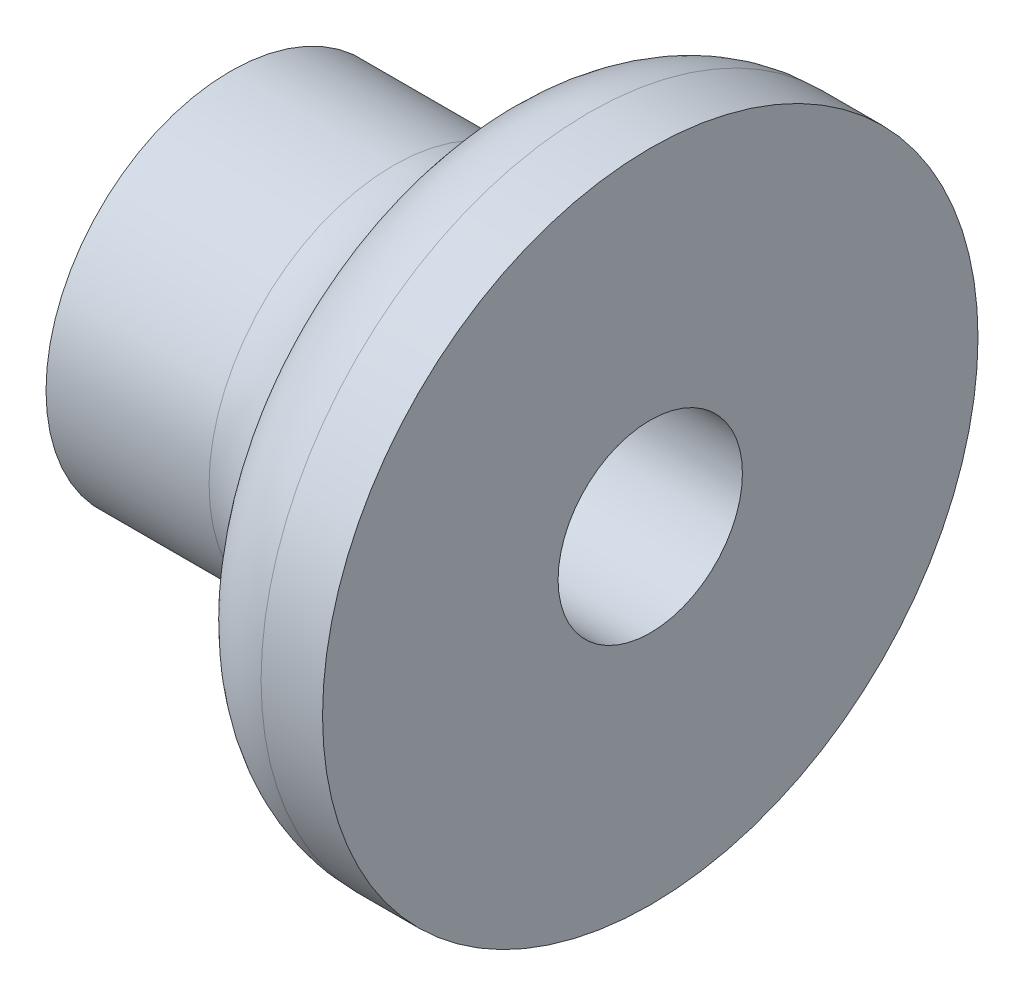
ISO-10303-21;
HEADER;
FILE_DESCRIPTION(('STEP AP214'),'2;1');
FILE_NAME('part.step','',(''),(''),'','','');
FILE_SCHEMA(('AUTOMOTIVE_DESIGN { 1 0 10303 214 1 1 1 1 }'));
ENDSEC;
DATA;
#1=APPLICATION_CONTEXT('core data for automotive mechanical design processes');
#2=APPLICATION_PROTOCOL_DEFINITION('international standard','automotive_design',2000,#1);
#3=PRODUCT_CONTEXT('',#1,'mechanical');
#4=PRODUCT('Part','Part','',(#3));
#5=PRODUCT_RELATED_PRODUCT_CATEGORY('part','',(#4));
#6=PRODUCT_DEFINITION_FORMATION('','',#4);
#7=PRODUCT_DEFINITION_CONTEXT('part definition',#1,'design');
#8=PRODUCT_DEFINITION('design','',#6,#7);
#9=PRODUCT_DEFINITION_SHAPE('','',#8);
#10=(LENGTH_UNIT() NAMED_UNIT(*) SI_UNIT(.MILLI.,.METRE.));
#11=(NAMED_UNIT(*) PLANE_ANGLE_UNIT() SI_UNIT($,.RADIAN.));
#12=(NAMED_UNIT(*) SI_UNIT($,.STERADIAN.) SOLID_ANGLE_UNIT());
#13=UNCERTAINTY_MEASURE_WITH_UNIT(LENGTH_MEASURE(1.E-05),#10,'distance_accuracy_value','');
#14=(GEOMETRIC_REPRESENTATION_CONTEXT(3) GLOBAL_UNCERTAINTY_ASSIGNED_CONTEXT((#13)) GLOBAL_UNIT_ASSIGNED_CONTEXT((#10,
#11,#12)) REPRESENTATION_CONTEXT('',''));
#15=CARTESIAN_POINT('',(0.,0.,0.));
#16=DIRECTION('',(0.,0.,1.));
#17=DIRECTION('',(1.,0.,0.));
#18=AXIS2_PLACEMENT_3D('',#15,#16,#17);
#19=CARTESIAN_POINT('',(10.25,0.,0.));
#20=DIRECTION('',(-1.,0.,0.));
#21=DIRECTION('',(0.,0.,1.));
#22=AXIS2_PLACEMENT_3D('',#19,#20,#21);
#23=CYLINDRICAL_SURFACE('',#22,4.5);
#24=CARTESIAN_POINT('',(3.98030399291527,0.,0.));
#25=DIRECTION('',(1.,0.,0.));
#26=DIRECTION('',(0.,0.,-1.));
#27=AXIS2_PLACEMENT_3D('',#24,#25,#26);
#28=CIRCLE('',#27,4.5);
#29=CARTESIAN_POINT('',(3.98030399291527,0.,-4.5));
#30=VERTEX_POINT('',#29);
#31=EDGE_CURVE('E10',#30,#30,#28,.F.);
#32=ORIENTED_EDGE('',*,*,#31,.T.);
#33=EDGE_LOOP('',(#32));
#34=FACE_BOUND('',#33,.T.);
#35=CARTESIAN_POINT('',(0.,0.,0.));
#36=DIRECTION('',(1.,0.,0.));
#37=DIRECTION('',(0.,0.,-1.));
#38=AXIS2_PLACEMENT_3D('',#35,#36,#37);
#39=CIRCLE('',#38,4.5);
#40=CARTESIAN_POINT('',(0.,0.,-4.5));
#41=VERTEX_POINT('',#40);
#42=EDGE_CURVE('E50',#41,#41,#39,.T.);
#43=ORIENTED_EDGE('',*,*,#42,.T.);
#44=EDGE_LOOP('',(#43));
#45=FACE_BOUND('',#44,.T.);
#46=ADVANCED_FACE('F35',(#34,#45),#23,.T.);
#47=CARTESIAN_POINT('',(10.25,0.,0.));
#48=DIRECTION('',(1.,0.,0.));
#49=DIRECTION('',(0.,0.,-1.));
#50=AXIS2_PLACEMENT_3D('',#47,#48,#49);
#51=PLANE('',#50);
#52=CARTESIAN_POINT('',(10.25,0.,0.));
#53=DIRECTION('',(1.,0.,0.));
#54=DIRECTION('',(0.,0.,-1.));
#55=AXIS2_PLACEMENT_3D('',#52,#53,#54);
#56=CIRCLE('',#55,2.25000000804048);
#57=CARTESIAN_POINT('',(10.25,0.,-2.25000000804048));
#58=VERTEX_POINT('',#57);
#59=EDGE_CURVE('E55',#58,#58,#56,.T.);
#60=ORIENTED_EDGE('',*,*,#59,.F.);
#61=EDGE_LOOP('',(#60));
#62=FACE_BOUND('',#61,.T.);
#63=CARTESIAN_POINT('',(10.25,0.,0.));
#64=DIRECTION('',(1.,0.,0.));
#65=DIRECTION('',(0.,0.,-1.));
#66=AXIS2_PLACEMENT_3D('',#63,#64,#65);
#67=CIRCLE('',#66,8.);
#68=CARTESIAN_POINT('',(10.25,0.,-8.));
#69=VERTEX_POINT('',#68);
#70=EDGE_CURVE('E61',#69,#69,#67,.T.);
#71=ORIENTED_EDGE('',*,*,#70,.T.);
#72=EDGE_LOOP('',(#71));
#73=FACE_BOUND('',#72,.T.);
#74=ADVANCED_FACE('F65',(#62,#73),#51,.T.);
#75=CARTESIAN_POINT('',(0.,0.,0.));
#76=DIRECTION('',(1.,0.,0.));
#77=DIRECTION('',(0.,0.,-1.));
#78=AXIS2_PLACEMENT_3D('',#75,#76,#77);
#79=PLANE('',#78);
#80=CARTESIAN_POINT('',(0.,0.,0.));
#81=DIRECTION('',(-1.,0.,0.));
#82=DIRECTION('',(0.,0.,1.));
#83=AXIS2_PLACEMENT_3D('',#80,#81,#82);
#84=CIRCLE('',#83,2.25000000804048);
#85=CARTESIAN_POINT('',(0.,0.,2.25000000804048));
#86=VERTEX_POINT('',#85);
#87=EDGE_CURVE('E58',#86,#86,#84,.T.);
#88=ORIENTED_EDGE('',*,*,#87,.F.);
#89=EDGE_LOOP('',(#88));
#90=FACE_BOUND('',#89,.T.);
#91=ORIENTED_EDGE('',*,*,#42,.F.);
#92=EDGE_LOOP('',(#91));
#93=FACE_BOUND('',#92,.T.);
#94=ADVANCED_FACE('F77',(#90,#93),#79,.F.);
#95=CARTESIAN_POINT('',(34.,0.,0.));
#96=DIRECTION('',(-1.,0.,0.));
#97=DIRECTION('',(0.,0.,1.));
#98=AXIS2_PLACEMENT_3D('',#95,#96,#97);
#99=CYLINDRICAL_SURFACE('',#98,2.25000000804048);
#100=ORIENTED_EDGE('',*,*,#59,.T.);
#101=EDGE_LOOP('',(#100));
#102=FACE_BOUND('',#101,.T.);
#103=ORIENTED_EDGE('',*,*,#87,.T.);
#104=EDGE_LOOP('',(#103));
#105=FACE_BOUND('',#104,.T.);
#106=ADVANCED_FACE('F70',(#102,#105),#99,.F.);
#107=CARTESIAN_POINT('',(6.25,0.,0.));
#108=DIRECTION('',(1.,0.,0.));
#109=DIRECTION('',(0.,0.,-1.));
#110=AXIS2_PLACEMENT_3D('',#107,#108,#109);
#111=CYLINDRICAL_SURFACE('',#110,8.);
#112=CARTESIAN_POINT('',(8.75,0.,0.));
#113=DIRECTION('',(1.,0.,0.));
#114=DIRECTION('',(0.,0.,-1.));
#115=AXIS2_PLACEMENT_3D('',#112,#113,#114);
#116=CIRCLE('',#115,8.);
#117=CARTESIAN_POINT('',(8.75,0.,-8.));
#118=VERTEX_POINT('',#117);
#119=EDGE_CURVE('E46',#118,#118,#116,.T.);
#120=ORIENTED_EDGE('',*,*,#119,.T.);
#121=EDGE_LOOP('',(#120));
#122=FACE_BOUND('',#121,.T.);
#123=ORIENTED_EDGE('',*,*,#70,.F.);
#124=EDGE_LOOP('',(#123));
#125=FACE_BOUND('',#124,.T.);
#126=ADVANCED_FACE('F67',(#122,#125),#111,.T.);
#127=CARTESIAN_POINT('',(8.75,0.,0.));
#128=DIRECTION('',(1.,0.,0.));
#129=DIRECTION('',(0.,0.,-1.));
#130=AXIS2_PLACEMENT_3D('',#127,#128,#129);
#131=TOROIDAL_SURFACE('',#130,5.5,2.5);
#132=CARTESIAN_POINT('',(6.36515199645764,0.,0.));
#133=DIRECTION('',(1.,0.,0.));
#134=DIRECTION('',(0.,0.,-1.));
#135=AXIS2_PLACEMENT_3D('',#132,#133,#134);
#136=CIRCLE('',#135,6.25);
#137=CARTESIAN_POINT('',(6.36515199645764,0.,-6.25));
#138=VERTEX_POINT('',#137);
#139=EDGE_CURVE('E42',#138,#138,#136,.T.);
#140=ORIENTED_EDGE('',*,*,#139,.T.);
#141=EDGE_LOOP('',(#140));
#142=FACE_BOUND('',#141,.T.);
#143=ORIENTED_EDGE('',*,*,#119,.F.);
#144=EDGE_LOOP('',(#143));
#145=FACE_BOUND('',#144,.T.);
#146=ADVANCED_FACE('F69',(#142,#145),#131,.T.);
#147=CARTESIAN_POINT('',(3.98030399291527,0.,0.));
#148=DIRECTION('',(1.,0.,0.));
#149=DIRECTION('',(0.,0.,-1.));
#150=AXIS2_PLACEMENT_3D('',#147,#148,#149);
#151=TOROIDAL_SURFACE('',#150,7.,2.5);
#152=ORIENTED_EDGE('',*,*,#31,.F.);
#153=EDGE_LOOP('',(#152));
#154=FACE_BOUND('',#153,.T.);
#155=ORIENTED_EDGE('',*,*,#139,.F.);
#156=EDGE_LOOP('',(#155));
#157=FACE_BOUND('',#156,.T.);
#158=ADVANCED_FACE('F37',(#154,#157),#151,.F.);
#159=CLOSED_SHELL('',(#46,#74,#94,#106,#126,#146,#158));
#160=MANIFOLD_SOLID_BREP('B2',#159);
#161=ADVANCED_BREP_SHAPE_REPRESENTATION('',(#18,#160),#14);
#162=SHAPE_DEFINITION_REPRESENTATION(#9,#161);
ENDSEC;
END-ISO-10303-21;
